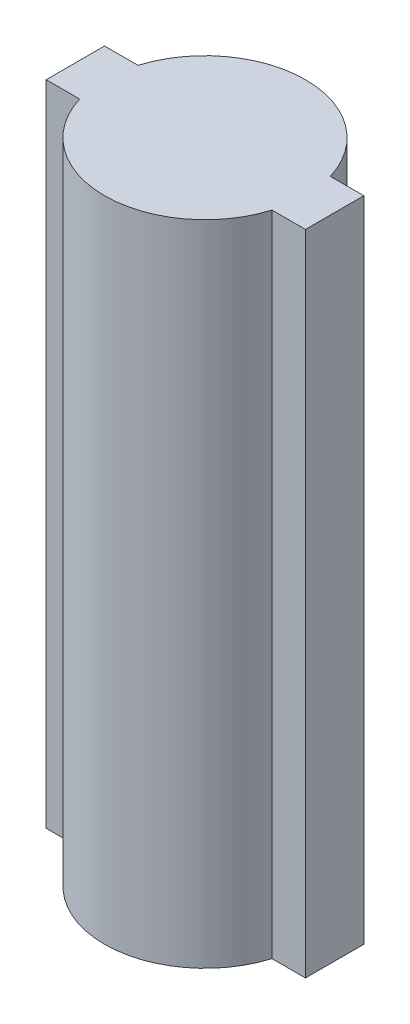
ISO-10303-21;
HEADER;
FILE_DESCRIPTION(('STEP AP214'),'2;1');
FILE_NAME('part.step','',(''),(''),'','','');
FILE_SCHEMA(('AUTOMOTIVE_DESIGN { 1 0 10303 214 1 1 1 1 }'));
ENDSEC;
DATA;
#1=APPLICATION_CONTEXT('core data for automotive mechanical design processes');
#2=APPLICATION_PROTOCOL_DEFINITION('international standard','automotive_design',2000,#1);
#3=PRODUCT_CONTEXT('',#1,'mechanical');
#4=PRODUCT('Part','Part','',(#3));
#5=PRODUCT_RELATED_PRODUCT_CATEGORY('part','',(#4));
#6=PRODUCT_DEFINITION_FORMATION('','',#4);
#7=PRODUCT_DEFINITION_CONTEXT('part definition',#1,'design');
#8=PRODUCT_DEFINITION('design','',#6,#7);
#9=PRODUCT_DEFINITION_SHAPE('','',#8);
#10=(LENGTH_UNIT() NAMED_UNIT(*) SI_UNIT(.MILLI.,.METRE.));
#11=(NAMED_UNIT(*) PLANE_ANGLE_UNIT() SI_UNIT($,.RADIAN.));
#12=(NAMED_UNIT(*) SI_UNIT($,.STERADIAN.) SOLID_ANGLE_UNIT());
#13=UNCERTAINTY_MEASURE_WITH_UNIT(LENGTH_MEASURE(1.E-05),#10,'distance_accuracy_value','');
#14=(GEOMETRIC_REPRESENTATION_CONTEXT(3) GLOBAL_UNCERTAINTY_ASSIGNED_CONTEXT((#13)) GLOBAL_UNIT_ASSIGNED_CONTEXT((#10,
#11,#12)) REPRESENTATION_CONTEXT('',''));
#15=CARTESIAN_POINT('',(0.,0.,0.));
#16=DIRECTION('',(0.,0.,1.));
#17=DIRECTION('',(1.,0.,0.));
#18=AXIS2_PLACEMENT_3D('',#15,#16,#17);
#19=CARTESIAN_POINT('',(0.,20.,0.9));
#20=DIRECTION('',(0.,0.,-1.));
#21=DIRECTION('',(-1.,0.,0.));
#22=AXIS2_PLACEMENT_3D('',#19,#20,#21);
#23=PLANE('',#22);
#24=DIRECTION('',(1.,0.,0.));
#25=VECTOR('',#24,1.);
#26=CARTESIAN_POINT('',(0.,0.,0.9));
#27=LINE('',#26,#25);
#28=CARTESIAN_POINT('',(-4.,0.,0.9));
#29=VERTEX_POINT('',#28);
#30=CARTESIAN_POINT('',(-2.96647939483826,0.,0.9));
#31=VERTEX_POINT('',#30);
#32=EDGE_CURVE('E136',#29,#31,#27,.T.);
#33=ORIENTED_EDGE('',*,*,#32,.T.);
#34=DIRECTION('',(0.,-1.,0.));
#35=VECTOR('',#34,1.);
#36=CARTESIAN_POINT('',(-2.96647939483826,20.,0.9));
#37=LINE('',#36,#35);
#38=CARTESIAN_POINT('',(-2.96647939483826,20.,0.9));
#39=VERTEX_POINT('',#38);
#40=EDGE_CURVE('E11',#39,#31,#37,.T.);
#41=ORIENTED_EDGE('',*,*,#40,.F.);
#42=DIRECTION('',(1.,0.,0.));
#43=VECTOR('',#42,1.);
#44=CARTESIAN_POINT('',(0.,20.,0.9));
#45=LINE('',#44,#43);
#46=CARTESIAN_POINT('',(-4.,20.,0.9));
#47=VERTEX_POINT('',#46);
#48=EDGE_CURVE('E154',#47,#39,#45,.T.);
#49=ORIENTED_EDGE('',*,*,#48,.F.);
#50=DIRECTION('',(0.,-1.,0.));
#51=VECTOR('',#50,1.);
#52=CARTESIAN_POINT('',(-4.,20.,0.9));
#53=LINE('',#52,#51);
#54=EDGE_CURVE('E132',#47,#29,#53,.T.);
#55=ORIENTED_EDGE('',*,*,#54,.T.);
#56=EDGE_LOOP('',(#33,#41,#49,#55));
#57=FACE_BOUND('',#56,.T.);
#58=ADVANCED_FACE('F41',(#57),#23,.F.);
#59=CARTESIAN_POINT('',(0.,20.,0.));
#60=DIRECTION('',(0.,-1.,0.));
#61=DIRECTION('',(0.,0.,-1.));
#62=AXIS2_PLACEMENT_3D('',#59,#60,#61);
#63=CYLINDRICAL_SURFACE('',#62,3.1);
#64=CARTESIAN_POINT('',(0.,0.,0.));
#65=DIRECTION('',(0.,1.,0.));
#66=DIRECTION('',(0.,0.,1.));
#67=AXIS2_PLACEMENT_3D('',#64,#65,#66);
#68=CIRCLE('',#67,3.1);
#69=CARTESIAN_POINT('',(2.96647939483826,0.,0.9));
#70=VERTEX_POINT('',#69);
#71=EDGE_CURVE('E139',#31,#70,#68,.T.);
#72=ORIENTED_EDGE('',*,*,#71,.T.);
#73=DIRECTION('',(0.,-1.,0.));
#74=VECTOR('',#73,1.);
#75=CARTESIAN_POINT('',(2.96647939483826,20.,0.9));
#76=LINE('',#75,#74);
#77=CARTESIAN_POINT('',(2.96647939483826,20.,0.9));
#78=VERTEX_POINT('',#77);
#79=EDGE_CURVE('E49',#78,#70,#76,.T.);
#80=ORIENTED_EDGE('',*,*,#79,.F.);
#81=CARTESIAN_POINT('',(0.,20.,0.));
#82=DIRECTION('',(0.,1.,0.));
#83=DIRECTION('',(0.,0.,1.));
#84=AXIS2_PLACEMENT_3D('',#81,#82,#83);
#85=CIRCLE('',#84,3.1);
#86=EDGE_CURVE('E96',#39,#78,#85,.T.);
#87=ORIENTED_EDGE('',*,*,#86,.F.);
#88=ORIENTED_EDGE('',*,*,#40,.T.);
#89=EDGE_LOOP('',(#72,#80,#87,#88));
#90=FACE_BOUND('',#89,.T.);
#91=ADVANCED_FACE('F184',(#90),#63,.T.);
#92=CARTESIAN_POINT('',(0.,20.,0.9));
#93=DIRECTION('',(0.,0.,-1.));
#94=DIRECTION('',(-1.,0.,0.));
#95=AXIS2_PLACEMENT_3D('',#92,#93,#94);
#96=PLANE('',#95);
#97=DIRECTION('',(1.,0.,0.));
#98=VECTOR('',#97,1.);
#99=CARTESIAN_POINT('',(0.,0.,0.9));
#100=LINE('',#99,#98);
#101=CARTESIAN_POINT('',(4.,0.,0.9));
#102=VERTEX_POINT('',#101);
#103=EDGE_CURVE('E141',#70,#102,#100,.T.);
#104=ORIENTED_EDGE('',*,*,#103,.T.);
#105=DIRECTION('',(0.,-1.,0.));
#106=VECTOR('',#105,1.);
#107=CARTESIAN_POINT('',(4.,20.,0.9));
#108=LINE('',#107,#106);
#109=CARTESIAN_POINT('',(4.,20.,0.9));
#110=VERTEX_POINT('',#109);
#111=EDGE_CURVE('E160',#110,#102,#108,.T.);
#112=ORIENTED_EDGE('',*,*,#111,.F.);
#113=DIRECTION('',(1.,0.,0.));
#114=VECTOR('',#113,1.);
#115=CARTESIAN_POINT('',(0.,20.,0.9));
#116=LINE('',#115,#114);
#117=EDGE_CURVE('E167',#78,#110,#116,.T.);
#118=ORIENTED_EDGE('',*,*,#117,.F.);
#119=ORIENTED_EDGE('',*,*,#79,.T.);
#120=EDGE_LOOP('',(#104,#112,#118,#119));
#121=FACE_BOUND('',#120,.T.);
#122=ADVANCED_FACE('F165',(#121),#96,.F.);
#123=CARTESIAN_POINT('',(4.,20.,0.));
#124=DIRECTION('',(1.,0.,0.));
#125=DIRECTION('',(0.,0.,-1.));
#126=AXIS2_PLACEMENT_3D('',#123,#124,#125);
#127=PLANE('',#126);
#128=DIRECTION('',(0.,0.,1.));
#129=VECTOR('',#128,1.);
#130=CARTESIAN_POINT('',(4.,0.,0.));
#131=LINE('',#130,#129);
#132=CARTESIAN_POINT('',(4.,0.,-0.9));
#133=VERTEX_POINT('',#132);
#134=EDGE_CURVE('E144',#133,#102,#131,.T.);
#135=ORIENTED_EDGE('',*,*,#134,.F.);
#136=DIRECTION('',(0.,-1.,0.));
#137=VECTOR('',#136,1.);
#138=CARTESIAN_POINT('',(4.,20.,-0.9));
#139=LINE('',#138,#137);
#140=CARTESIAN_POINT('',(4.,20.,-0.9));
#141=VERTEX_POINT('',#140);
#142=EDGE_CURVE('E158',#141,#133,#139,.T.);
#143=ORIENTED_EDGE('',*,*,#142,.F.);
#144=DIRECTION('',(0.,0.,1.));
#145=VECTOR('',#144,1.);
#146=CARTESIAN_POINT('',(4.,20.,0.));
#147=LINE('',#146,#145);
#148=EDGE_CURVE('E176',#141,#110,#147,.T.);
#149=ORIENTED_EDGE('',*,*,#148,.T.);
#150=ORIENTED_EDGE('',*,*,#111,.T.);
#151=EDGE_LOOP('',(#135,#143,#149,#150));
#152=FACE_BOUND('',#151,.T.);
#153=ADVANCED_FACE('F174',(#152),#127,.T.);
#154=CARTESIAN_POINT('',(0.,20.,-0.9));
#155=DIRECTION('',(0.,0.,-1.));
#156=DIRECTION('',(-1.,0.,0.));
#157=AXIS2_PLACEMENT_3D('',#154,#155,#156);
#158=PLANE('',#157);
#159=DIRECTION('',(1.,0.,0.));
#160=VECTOR('',#159,1.);
#161=CARTESIAN_POINT('',(0.,0.,-0.9));
#162=LINE('',#161,#160);
#163=CARTESIAN_POINT('',(2.96647939483826,0.,-0.9));
#164=VERTEX_POINT('',#163);
#165=EDGE_CURVE('E147',#164,#133,#162,.T.);
#166=ORIENTED_EDGE('',*,*,#165,.F.);
#167=DIRECTION('',(0.,-1.,0.));
#168=VECTOR('',#167,1.);
#169=CARTESIAN_POINT('',(2.96647939483826,20.,-0.9));
#170=LINE('',#169,#168);
#171=CARTESIAN_POINT('',(2.96647939483826,20.,-0.9));
#172=VERTEX_POINT('',#171);
#173=EDGE_CURVE('E128',#172,#164,#170,.T.);
#174=ORIENTED_EDGE('',*,*,#173,.F.);
#175=DIRECTION('',(1.,0.,0.));
#176=VECTOR('',#175,1.);
#177=CARTESIAN_POINT('',(0.,20.,-0.9));
#178=LINE('',#177,#176);
#179=EDGE_CURVE('E117',#172,#141,#178,.T.);
#180=ORIENTED_EDGE('',*,*,#179,.T.);
#181=ORIENTED_EDGE('',*,*,#142,.T.);
#182=EDGE_LOOP('',(#166,#174,#180,#181));
#183=FACE_BOUND('',#182,.T.);
#184=ADVANCED_FACE('F194',(#183),#158,.T.);
#185=CARTESIAN_POINT('',(0.,20.,0.));
#186=DIRECTION('',(0.,-1.,0.));
#187=DIRECTION('',(0.,0.,-1.));
#188=AXIS2_PLACEMENT_3D('',#185,#186,#187);
#189=CYLINDRICAL_SURFACE('',#188,3.1);
#190=CARTESIAN_POINT('',(0.,0.,0.));
#191=DIRECTION('',(0.,1.,0.));
#192=DIRECTION('',(0.,0.,1.));
#193=AXIS2_PLACEMENT_3D('',#190,#191,#192);
#194=CIRCLE('',#193,3.1);
#195=CARTESIAN_POINT('',(-2.96647939483826,0.,-0.9));
#196=VERTEX_POINT('',#195);
#197=EDGE_CURVE('E124',#164,#196,#194,.T.);
#198=ORIENTED_EDGE('',*,*,#197,.T.);
#199=DIRECTION('',(0.,-1.,0.));
#200=VECTOR('',#199,1.);
#201=CARTESIAN_POINT('',(-2.96647939483826,20.,-0.9));
#202=LINE('',#201,#200);
#203=CARTESIAN_POINT('',(-2.96647939483826,20.,-0.9));
#204=VERTEX_POINT('',#203);
#205=EDGE_CURVE('E121',#204,#196,#202,.T.);
#206=ORIENTED_EDGE('',*,*,#205,.F.);
#207=CARTESIAN_POINT('',(0.,20.,0.));
#208=DIRECTION('',(0.,1.,0.));
#209=DIRECTION('',(0.,0.,1.));
#210=AXIS2_PLACEMENT_3D('',#207,#208,#209);
#211=CIRCLE('',#210,3.1);
#212=EDGE_CURVE('E110',#172,#204,#211,.T.);
#213=ORIENTED_EDGE('',*,*,#212,.F.);
#214=ORIENTED_EDGE('',*,*,#173,.T.);
#215=EDGE_LOOP('',(#198,#206,#213,#214));
#216=FACE_BOUND('',#215,.T.);
#217=ADVANCED_FACE('F122',(#216),#189,.T.);
#218=CARTESIAN_POINT('',(0.,20.,-0.9));
#219=DIRECTION('',(0.,0.,-1.));
#220=DIRECTION('',(-1.,0.,0.));
#221=AXIS2_PLACEMENT_3D('',#218,#219,#220);
#222=PLANE('',#221);
#223=DIRECTION('',(1.,0.,0.));
#224=VECTOR('',#223,1.);
#225=CARTESIAN_POINT('',(0.,0.,-0.9));
#226=LINE('',#225,#224);
#227=CARTESIAN_POINT('',(-4.,0.,-0.9));
#228=VERTEX_POINT('',#227);
#229=EDGE_CURVE('E151',#228,#196,#226,.T.);
#230=ORIENTED_EDGE('',*,*,#229,.F.);
#231=DIRECTION('',(0.,-1.,0.));
#232=VECTOR('',#231,1.);
#233=CARTESIAN_POINT('',(-4.,20.,-0.9));
#234=LINE('',#233,#232);
#235=CARTESIAN_POINT('',(-4.,20.,-0.9));
#236=VERTEX_POINT('',#235);
#237=EDGE_CURVE('E85',#236,#228,#234,.T.);
#238=ORIENTED_EDGE('',*,*,#237,.F.);
#239=DIRECTION('',(1.,0.,0.));
#240=VECTOR('',#239,1.);
#241=CARTESIAN_POINT('',(0.,20.,-0.9));
#242=LINE('',#241,#240);
#243=EDGE_CURVE('E114',#236,#204,#242,.T.);
#244=ORIENTED_EDGE('',*,*,#243,.T.);
#245=ORIENTED_EDGE('',*,*,#205,.T.);
#246=EDGE_LOOP('',(#230,#238,#244,#245));
#247=FACE_BOUND('',#246,.T.);
#248=ADVANCED_FACE('F130',(#247),#222,.T.);
#249=CARTESIAN_POINT('',(-4.,20.,0.));
#250=DIRECTION('',(1.,0.,0.));
#251=DIRECTION('',(0.,0.,-1.));
#252=AXIS2_PLACEMENT_3D('',#249,#250,#251);
#253=PLANE('',#252);
#254=DIRECTION('',(0.,0.,1.));
#255=VECTOR('',#254,1.);
#256=CARTESIAN_POINT('',(-4.,0.,0.));
#257=LINE('',#256,#255);
#258=EDGE_CURVE('E88',#228,#29,#257,.T.);
#259=ORIENTED_EDGE('',*,*,#258,.T.);
#260=ORIENTED_EDGE('',*,*,#54,.F.);
#261=DIRECTION('',(0.,0.,1.));
#262=VECTOR('',#261,1.);
#263=CARTESIAN_POINT('',(-4.,20.,0.));
#264=LINE('',#263,#262);
#265=EDGE_CURVE('E57',#236,#47,#264,.T.);
#266=ORIENTED_EDGE('',*,*,#265,.F.);
#267=ORIENTED_EDGE('',*,*,#237,.T.);
#268=EDGE_LOOP('',(#259,#260,#266,#267));
#269=FACE_BOUND('',#268,.T.);
#270=ADVANCED_FACE('F202',(#269),#253,.F.);
#271=CARTESIAN_POINT('',(0.,20.,0.));
#272=DIRECTION('',(0.,1.,0.));
#273=DIRECTION('',(0.,0.,1.));
#274=AXIS2_PLACEMENT_3D('',#271,#272,#273);
#275=PLANE('',#274);
#276=ORIENTED_EDGE('',*,*,#48,.T.);
#277=ORIENTED_EDGE('',*,*,#86,.T.);
#278=ORIENTED_EDGE('',*,*,#117,.T.);
#279=ORIENTED_EDGE('',*,*,#148,.F.);
#280=ORIENTED_EDGE('',*,*,#179,.F.);
#281=ORIENTED_EDGE('',*,*,#212,.T.);
#282=ORIENTED_EDGE('',*,*,#243,.F.);
#283=ORIENTED_EDGE('',*,*,#265,.T.);
#284=EDGE_LOOP('',(#276,#277,#278,#279,#280,#281,#282,#283));
#285=FACE_BOUND('',#284,.T.);
#286=ADVANCED_FACE('F112',(#285),#275,.T.);
#287=CARTESIAN_POINT('',(0.,0.,0.));
#288=DIRECTION('',(0.,1.,0.));
#289=DIRECTION('',(0.,0.,1.));
#290=AXIS2_PLACEMENT_3D('',#287,#288,#289);
#291=PLANE('',#290);
#292=ORIENTED_EDGE('',*,*,#32,.F.);
#293=ORIENTED_EDGE('',*,*,#258,.F.);
#294=ORIENTED_EDGE('',*,*,#229,.T.);
#295=ORIENTED_EDGE('',*,*,#197,.F.);
#296=ORIENTED_EDGE('',*,*,#165,.T.);
#297=ORIENTED_EDGE('',*,*,#134,.T.);
#298=ORIENTED_EDGE('',*,*,#103,.F.);
#299=ORIENTED_EDGE('',*,*,#71,.F.);
#300=EDGE_LOOP('',(#292,#293,#294,#295,#296,#297,#298,#299));
#301=FACE_BOUND('',#300,.T.);
#302=ADVANCED_FACE('F170',(#301),#291,.F.);
#303=CLOSED_SHELL('',(#58,#91,#122,#153,#184,#217,#248,#270,#286,#302));
#304=MANIFOLD_SOLID_BREP('B2',#303);
#305=ADVANCED_BREP_SHAPE_REPRESENTATION('',(#18,#304),#14);
#306=SHAPE_DEFINITION_REPRESENTATION(#9,#305);
ENDSEC;
END-ISO-10303-21;
